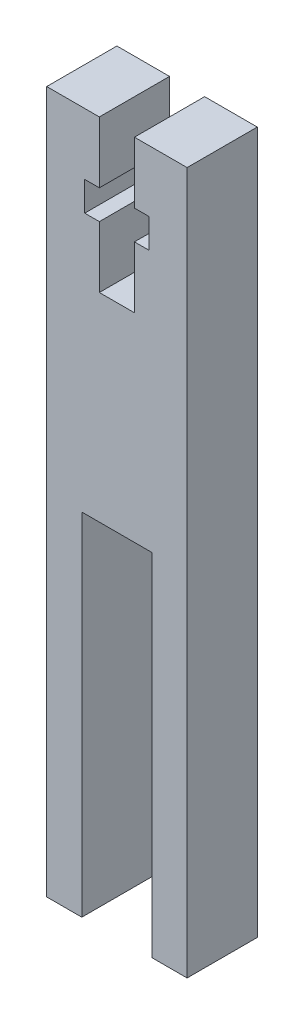
ISO-10303-21;
HEADER;
FILE_DESCRIPTION(('STEP AP214'),'2;1');
FILE_NAME('part.step','',(''),(''),'','','');
FILE_SCHEMA(('AUTOMOTIVE_DESIGN { 1 0 10303 214 1 1 1 1 }'));
ENDSEC;
DATA;
#1=APPLICATION_CONTEXT('core data for automotive mechanical design processes');
#2=APPLICATION_PROTOCOL_DEFINITION('international standard','automotive_design',2000,#1);
#3=PRODUCT_CONTEXT('',#1,'mechanical');
#4=PRODUCT('Part','Part','',(#3));
#5=PRODUCT_RELATED_PRODUCT_CATEGORY('part','',(#4));
#6=PRODUCT_DEFINITION_FORMATION('','',#4);
#7=PRODUCT_DEFINITION_CONTEXT('part definition',#1,'design');
#8=PRODUCT_DEFINITION('design','',#6,#7);
#9=PRODUCT_DEFINITION_SHAPE('','',#8);
#10=(LENGTH_UNIT() NAMED_UNIT(*) SI_UNIT(.MILLI.,.METRE.));
#11=(NAMED_UNIT(*) PLANE_ANGLE_UNIT() SI_UNIT($,.RADIAN.));
#12=(NAMED_UNIT(*) SI_UNIT($,.STERADIAN.) SOLID_ANGLE_UNIT());
#13=UNCERTAINTY_MEASURE_WITH_UNIT(LENGTH_MEASURE(1.E-05),#10,'distance_accuracy_value','');
#14=(GEOMETRIC_REPRESENTATION_CONTEXT(3) GLOBAL_UNCERTAINTY_ASSIGNED_CONTEXT((#13)) GLOBAL_UNIT_ASSIGNED_CONTEXT((#10,
#11,#12)) REPRESENTATION_CONTEXT('',''));
#15=CARTESIAN_POINT('',(0.,0.,0.));
#16=DIRECTION('',(0.,0.,1.));
#17=DIRECTION('',(1.,0.,0.));
#18=AXIS2_PLACEMENT_3D('',#15,#16,#17);
#19=CARTESIAN_POINT('',(-1.5,60.,6.));
#20=DIRECTION('',(0.,-1.,0.));
#21=DIRECTION('',(1.,0.,0.));
#22=AXIS2_PLACEMENT_3D('',#19,#20,#21);
#23=PLANE('',#22);
#24=DIRECTION('',(-1.,0.,0.));
#25=VECTOR('',#24,1.);
#26=CARTESIAN_POINT('',(-1.5,60.,0.));
#27=LINE('',#26,#25);
#28=CARTESIAN_POINT('',(-1.5,60.,0.));
#29=VERTEX_POINT('',#28);
#30=CARTESIAN_POINT('',(-5.99999999999999,60.,0.));
#31=VERTEX_POINT('',#30);
#32=EDGE_CURVE('E212',#29,#31,#27,.T.);
#33=ORIENTED_EDGE('',*,*,#32,.T.);
#34=DIRECTION('',(0.,0.,-1.));
#35=VECTOR('',#34,1.);
#36=CARTESIAN_POINT('',(-5.99999999999999,60.,6.));
#37=LINE('',#36,#35);
#38=CARTESIAN_POINT('',(-5.99999999999999,60.,6.));
#39=VERTEX_POINT('',#38);
#40=EDGE_CURVE('E11',#39,#31,#37,.T.);
#41=ORIENTED_EDGE('',*,*,#40,.F.);
#42=DIRECTION('',(-1.,0.,0.));
#43=VECTOR('',#42,1.);
#44=CARTESIAN_POINT('',(-1.5,60.,6.));
#45=LINE('',#44,#43);
#46=CARTESIAN_POINT('',(-1.5,60.,6.));
#47=VERTEX_POINT('',#46);
#48=EDGE_CURVE('E270',#47,#39,#45,.T.);
#49=ORIENTED_EDGE('',*,*,#48,.F.);
#50=DIRECTION('',(0.,0.,-1.));
#51=VECTOR('',#50,1.);
#52=CARTESIAN_POINT('',(-1.5,60.,6.));
#53=LINE('',#52,#51);
#54=EDGE_CURVE('E208',#47,#29,#53,.T.);
#55=ORIENTED_EDGE('',*,*,#54,.T.);
#56=EDGE_LOOP('',(#33,#41,#49,#55));
#57=FACE_BOUND('',#56,.T.);
#58=ADVANCED_FACE('F39',(#57),#23,.F.);
#59=CARTESIAN_POINT('',(-5.99999999999999,60.,6.));
#60=DIRECTION('',(1.,0.,0.));
#61=DIRECTION('',(0.,1.,0.));
#62=AXIS2_PLACEMENT_3D('',#59,#60,#61);
#63=PLANE('',#62);
#64=DIRECTION('',(0.,-1.,0.));
#65=VECTOR('',#64,1.);
#66=CARTESIAN_POINT('',(-5.99999999999999,60.,0.));
#67=LINE('',#66,#65);
#68=CARTESIAN_POINT('',(-5.99999999999999,0.,0.));
#69=VERTEX_POINT('',#68);
#70=EDGE_CURVE('E216',#31,#69,#67,.T.);
#71=ORIENTED_EDGE('',*,*,#70,.T.);
#72=DIRECTION('',(0.,0.,-1.));
#73=VECTOR('',#72,1.);
#74=CARTESIAN_POINT('',(-5.99999999999999,0.,6.));
#75=LINE('',#74,#73);
#76=CARTESIAN_POINT('',(-5.99999999999999,0.,6.));
#77=VERTEX_POINT('',#76);
#78=EDGE_CURVE('E48',#77,#69,#75,.T.);
#79=ORIENTED_EDGE('',*,*,#78,.F.);
#80=DIRECTION('',(0.,-1.,0.));
#81=VECTOR('',#80,1.);
#82=CARTESIAN_POINT('',(-5.99999999999999,60.,6.));
#83=LINE('',#82,#81);
#84=EDGE_CURVE('E135',#39,#77,#83,.T.);
#85=ORIENTED_EDGE('',*,*,#84,.F.);
#86=ORIENTED_EDGE('',*,*,#40,.T.);
#87=EDGE_LOOP('',(#71,#79,#85,#86));
#88=FACE_BOUND('',#87,.T.);
#89=ADVANCED_FACE('F420',(#88),#63,.F.);
#90=CARTESIAN_POINT('',(-5.99999999999999,0.,6.));
#91=DIRECTION('',(0.,1.,0.));
#92=DIRECTION('',(0.,0.,1.));
#93=AXIS2_PLACEMENT_3D('',#90,#91,#92);
#94=PLANE('',#93);
#95=DIRECTION('',(1.,0.,0.));
#96=VECTOR('',#95,1.);
#97=CARTESIAN_POINT('',(-5.99999999999999,0.,0.));
#98=LINE('',#97,#96);
#99=CARTESIAN_POINT('',(-3.,0.,0.));
#100=VERTEX_POINT('',#99);
#101=EDGE_CURVE('E219',#69,#100,#98,.T.);
#102=ORIENTED_EDGE('',*,*,#101,.T.);
#103=DIRECTION('',(0.,0.,-1.));
#104=VECTOR('',#103,1.);
#105=CARTESIAN_POINT('',(-3.,0.,6.));
#106=LINE('',#105,#104);
#107=CARTESIAN_POINT('',(-3.,0.,6.));
#108=VERTEX_POINT('',#107);
#109=EDGE_CURVE('E329',#108,#100,#106,.T.);
#110=ORIENTED_EDGE('',*,*,#109,.F.);
#111=DIRECTION('',(1.,0.,0.));
#112=VECTOR('',#111,1.);
#113=CARTESIAN_POINT('',(-5.99999999999999,0.,6.));
#114=LINE('',#113,#112);
#115=EDGE_CURVE('E339',#77,#108,#114,.T.);
#116=ORIENTED_EDGE('',*,*,#115,.F.);
#117=ORIENTED_EDGE('',*,*,#78,.T.);
#118=EDGE_LOOP('',(#102,#110,#116,#117));
#119=FACE_BOUND('',#118,.T.);
#120=ADVANCED_FACE('F337',(#119),#94,.F.);
#121=CARTESIAN_POINT('',(-3.,0.,6.));
#122=DIRECTION('',(-1.,0.,0.));
#123=DIRECTION('',(0.,0.,1.));
#124=AXIS2_PLACEMENT_3D('',#121,#122,#123);
#125=PLANE('',#124);
#126=DIRECTION('',(0.,1.,0.));
#127=VECTOR('',#126,1.);
#128=CARTESIAN_POINT('',(-3.,0.,0.));
#129=LINE('',#128,#127);
#130=CARTESIAN_POINT('',(-3.,30.,0.));
#131=VERTEX_POINT('',#130);
#132=EDGE_CURVE('E222',#100,#131,#129,.T.);
#133=ORIENTED_EDGE('',*,*,#132,.T.);
#134=DIRECTION('',(0.,0.,-1.));
#135=VECTOR('',#134,1.);
#136=CARTESIAN_POINT('',(-3.,30.,6.));
#137=LINE('',#136,#135);
#138=CARTESIAN_POINT('',(-3.,30.,6.));
#139=VERTEX_POINT('',#138);
#140=EDGE_CURVE('E325',#139,#131,#137,.T.);
#141=ORIENTED_EDGE('',*,*,#140,.F.);
#142=DIRECTION('',(0.,1.,0.));
#143=VECTOR('',#142,1.);
#144=CARTESIAN_POINT('',(-3.,0.,6.));
#145=LINE('',#144,#143);
#146=EDGE_CURVE('E358',#108,#139,#145,.T.);
#147=ORIENTED_EDGE('',*,*,#146,.F.);
#148=ORIENTED_EDGE('',*,*,#109,.T.);
#149=EDGE_LOOP('',(#133,#141,#147,#148));
#150=FACE_BOUND('',#149,.T.);
#151=ADVANCED_FACE('F348',(#150),#125,.F.);
#152=CARTESIAN_POINT('',(-3.,30.,6.));
#153=DIRECTION('',(0.,1.,0.));
#154=DIRECTION('',(0.,0.,1.));
#155=AXIS2_PLACEMENT_3D('',#152,#153,#154);
#156=PLANE('',#155);
#157=DIRECTION('',(1.,0.,0.));
#158=VECTOR('',#157,1.);
#159=CARTESIAN_POINT('',(-3.,30.,0.));
#160=LINE('',#159,#158);
#161=CARTESIAN_POINT('',(3.,30.,0.));
#162=VERTEX_POINT('',#161);
#163=EDGE_CURVE('E225',#131,#162,#160,.T.);
#164=ORIENTED_EDGE('',*,*,#163,.T.);
#165=DIRECTION('',(0.,0.,-1.));
#166=VECTOR('',#165,1.);
#167=CARTESIAN_POINT('',(3.,30.,6.));
#168=LINE('',#167,#166);
#169=CARTESIAN_POINT('',(3.,30.,6.));
#170=VERTEX_POINT('',#169);
#171=EDGE_CURVE('E321',#170,#162,#168,.T.);
#172=ORIENTED_EDGE('',*,*,#171,.F.);
#173=DIRECTION('',(1.,0.,0.));
#174=VECTOR('',#173,1.);
#175=CARTESIAN_POINT('',(-3.,30.,6.));
#176=LINE('',#175,#174);
#177=EDGE_CURVE('E354',#139,#170,#176,.T.);
#178=ORIENTED_EDGE('',*,*,#177,.F.);
#179=ORIENTED_EDGE('',*,*,#140,.T.);
#180=EDGE_LOOP('',(#164,#172,#178,#179));
#181=FACE_BOUND('',#180,.T.);
#182=ADVANCED_FACE('F352',(#181),#156,.F.);
#183=CARTESIAN_POINT('',(3.,0.,6.));
#184=DIRECTION('',(1.,0.,0.));
#185=DIRECTION('',(0.,0.,-1.));
#186=AXIS2_PLACEMENT_3D('',#183,#184,#185);
#187=PLANE('',#186);
#188=DIRECTION('',(0.,-1.,0.));
#189=VECTOR('',#188,1.);
#190=CARTESIAN_POINT('',(3.,0.,0.));
#191=LINE('',#190,#189);
#192=CARTESIAN_POINT('',(3.,0.,0.));
#193=VERTEX_POINT('',#192);
#194=EDGE_CURVE('E228',#162,#193,#191,.T.);
#195=ORIENTED_EDGE('',*,*,#194,.T.);
#196=DIRECTION('',(0.,0.,-1.));
#197=VECTOR('',#196,1.);
#198=CARTESIAN_POINT('',(3.,0.,6.));
#199=LINE('',#198,#197);
#200=CARTESIAN_POINT('',(3.,0.,6.));
#201=VERTEX_POINT('',#200);
#202=EDGE_CURVE('E317',#201,#193,#199,.T.);
#203=ORIENTED_EDGE('',*,*,#202,.F.);
#204=DIRECTION('',(0.,-1.,0.));
#205=VECTOR('',#204,1.);
#206=CARTESIAN_POINT('',(3.,0.,6.));
#207=LINE('',#206,#205);
#208=EDGE_CURVE('E357',#170,#201,#207,.T.);
#209=ORIENTED_EDGE('',*,*,#208,.F.);
#210=ORIENTED_EDGE('',*,*,#171,.T.);
#211=EDGE_LOOP('',(#195,#203,#209,#210));
#212=FACE_BOUND('',#211,.T.);
#213=ADVANCED_FACE('F433',(#212),#187,.F.);
#214=CARTESIAN_POINT('',(5.99999999999999,0.,6.));
#215=DIRECTION('',(0.,1.,0.));
#216=DIRECTION('',(0.,0.,1.));
#217=AXIS2_PLACEMENT_3D('',#214,#215,#216);
#218=PLANE('',#217);
#219=DIRECTION('',(1.,0.,0.));
#220=VECTOR('',#219,1.);
#221=CARTESIAN_POINT('',(5.99999999999999,0.,0.));
#222=LINE('',#221,#220);
#223=CARTESIAN_POINT('',(5.99999999999999,0.,0.));
#224=VERTEX_POINT('',#223);
#225=EDGE_CURVE('E231',#193,#224,#222,.T.);
#226=ORIENTED_EDGE('',*,*,#225,.T.);
#227=DIRECTION('',(0.,0.,-1.));
#228=VECTOR('',#227,1.);
#229=CARTESIAN_POINT('',(5.99999999999999,0.,6.));
#230=LINE('',#229,#228);
#231=CARTESIAN_POINT('',(5.99999999999999,0.,6.));
#232=VERTEX_POINT('',#231);
#233=EDGE_CURVE('E313',#232,#224,#230,.T.);
#234=ORIENTED_EDGE('',*,*,#233,.F.);
#235=DIRECTION('',(1.,0.,0.));
#236=VECTOR('',#235,1.);
#237=CARTESIAN_POINT('',(5.99999999999999,0.,6.));
#238=LINE('',#237,#236);
#239=EDGE_CURVE('E362',#201,#232,#238,.T.);
#240=ORIENTED_EDGE('',*,*,#239,.F.);
#241=ORIENTED_EDGE('',*,*,#202,.T.);
#242=EDGE_LOOP('',(#226,#234,#240,#241));
#243=FACE_BOUND('',#242,.T.);
#244=ADVANCED_FACE('F436',(#243),#218,.F.);
#245=CARTESIAN_POINT('',(5.99999999999999,60.,6.));
#246=DIRECTION('',(-1.,0.,0.));
#247=DIRECTION('',(0.,-1.,0.));
#248=AXIS2_PLACEMENT_3D('',#245,#246,#247);
#249=PLANE('',#248);
#250=DIRECTION('',(0.,1.,0.));
#251=VECTOR('',#250,1.);
#252=CARTESIAN_POINT('',(5.99999999999999,60.,0.));
#253=LINE('',#252,#251);
#254=CARTESIAN_POINT('',(5.99999999999999,60.,0.));
#255=VERTEX_POINT('',#254);
#256=EDGE_CURVE('E234',#224,#255,#253,.T.);
#257=ORIENTED_EDGE('',*,*,#256,.T.);
#258=DIRECTION('',(0.,0.,-1.));
#259=VECTOR('',#258,1.);
#260=CARTESIAN_POINT('',(5.99999999999999,60.,6.));
#261=LINE('',#260,#259);
#262=CARTESIAN_POINT('',(5.99999999999999,60.,6.));
#263=VERTEX_POINT('',#262);
#264=EDGE_CURVE('E309',#263,#255,#261,.T.);
#265=ORIENTED_EDGE('',*,*,#264,.F.);
#266=DIRECTION('',(0.,1.,0.));
#267=VECTOR('',#266,1.);
#268=CARTESIAN_POINT('',(5.99999999999999,60.,6.));
#269=LINE('',#268,#267);
#270=EDGE_CURVE('E369',#232,#263,#269,.T.);
#271=ORIENTED_EDGE('',*,*,#270,.F.);
#272=ORIENTED_EDGE('',*,*,#233,.T.);
#273=EDGE_LOOP('',(#257,#265,#271,#272));
#274=FACE_BOUND('',#273,.T.);
#275=ADVANCED_FACE('F440',(#274),#249,.F.);
#276=CARTESIAN_POINT('',(1.5,60.,6.));
#277=DIRECTION('',(0.,-1.,0.));
#278=DIRECTION('',(1.,0.,0.));
#279=AXIS2_PLACEMENT_3D('',#276,#277,#278);
#280=PLANE('',#279);
#281=DIRECTION('',(-1.,0.,0.));
#282=VECTOR('',#281,1.);
#283=CARTESIAN_POINT('',(1.5,60.,0.));
#284=LINE('',#283,#282);
#285=CARTESIAN_POINT('',(1.5,60.,0.));
#286=VERTEX_POINT('',#285);
#287=EDGE_CURVE('E237',#255,#286,#284,.T.);
#288=ORIENTED_EDGE('',*,*,#287,.T.);
#289=DIRECTION('',(0.,0.,-1.));
#290=VECTOR('',#289,1.);
#291=CARTESIAN_POINT('',(1.5,60.,6.));
#292=LINE('',#291,#290);
#293=CARTESIAN_POINT('',(1.5,60.,6.));
#294=VERTEX_POINT('',#293);
#295=EDGE_CURVE('E305',#294,#286,#292,.T.);
#296=ORIENTED_EDGE('',*,*,#295,.F.);
#297=DIRECTION('',(-1.,0.,0.));
#298=VECTOR('',#297,1.);
#299=CARTESIAN_POINT('',(1.5,60.,6.));
#300=LINE('',#299,#298);
#301=EDGE_CURVE('E372',#263,#294,#300,.T.);
#302=ORIENTED_EDGE('',*,*,#301,.F.);
#303=ORIENTED_EDGE('',*,*,#264,.T.);
#304=EDGE_LOOP('',(#288,#296,#302,#303));
#305=FACE_BOUND('',#304,.T.);
#306=ADVANCED_FACE('F444',(#305),#280,.F.);
#307=CARTESIAN_POINT('',(1.5,60.,6.));
#308=DIRECTION('',(1.,0.,0.));
#309=DIRECTION('',(0.,1.,0.));
#310=AXIS2_PLACEMENT_3D('',#307,#308,#309);
#311=PLANE('',#310);
#312=DIRECTION('',(0.,-1.,0.));
#313=VECTOR('',#312,1.);
#314=CARTESIAN_POINT('',(1.5,60.,0.));
#315=LINE('',#314,#313);
#316=CARTESIAN_POINT('',(1.5,54.75,0.));
#317=VERTEX_POINT('',#316);
#318=EDGE_CURVE('E240',#286,#317,#315,.T.);
#319=ORIENTED_EDGE('',*,*,#318,.T.);
#320=DIRECTION('',(0.,0.,-1.));
#321=VECTOR('',#320,1.);
#322=CARTESIAN_POINT('',(1.5,54.75,6.));
#323=LINE('',#322,#321);
#324=CARTESIAN_POINT('',(1.5,54.75,6.));
#325=VERTEX_POINT('',#324);
#326=EDGE_CURVE('E301',#325,#317,#323,.T.);
#327=ORIENTED_EDGE('',*,*,#326,.F.);
#328=DIRECTION('',(0.,-1.,0.));
#329=VECTOR('',#328,1.);
#330=CARTESIAN_POINT('',(1.5,60.,6.));
#331=LINE('',#330,#329);
#332=EDGE_CURVE('E375',#294,#325,#331,.T.);
#333=ORIENTED_EDGE('',*,*,#332,.F.);
#334=ORIENTED_EDGE('',*,*,#295,.T.);
#335=EDGE_LOOP('',(#319,#327,#333,#334));
#336=FACE_BOUND('',#335,.T.);
#337=ADVANCED_FACE('F448',(#336),#311,.F.);
#338=CARTESIAN_POINT('',(1.5,54.75,6.));
#339=DIRECTION('',(0.,1.,0.));
#340=DIRECTION('',(0.,0.,1.));
#341=AXIS2_PLACEMENT_3D('',#338,#339,#340);
#342=PLANE('',#341);
#343=DIRECTION('',(1.,0.,0.));
#344=VECTOR('',#343,1.);
#345=CARTESIAN_POINT('',(1.5,54.75,0.));
#346=LINE('',#345,#344);
#347=CARTESIAN_POINT('',(2.75,54.75,0.));
#348=VERTEX_POINT('',#347);
#349=EDGE_CURVE('E243',#317,#348,#346,.T.);
#350=ORIENTED_EDGE('',*,*,#349,.T.);
#351=DIRECTION('',(0.,0.,-1.));
#352=VECTOR('',#351,1.);
#353=CARTESIAN_POINT('',(2.75,54.75,6.));
#354=LINE('',#353,#352);
#355=CARTESIAN_POINT('',(2.75,54.75,6.));
#356=VERTEX_POINT('',#355);
#357=EDGE_CURVE('E297',#356,#348,#354,.T.);
#358=ORIENTED_EDGE('',*,*,#357,.F.);
#359=DIRECTION('',(1.,0.,0.));
#360=VECTOR('',#359,1.);
#361=CARTESIAN_POINT('',(1.5,54.75,6.));
#362=LINE('',#361,#360);
#363=EDGE_CURVE('E378',#325,#356,#362,.T.);
#364=ORIENTED_EDGE('',*,*,#363,.F.);
#365=ORIENTED_EDGE('',*,*,#326,.T.);
#366=EDGE_LOOP('',(#350,#358,#364,#365));
#367=FACE_BOUND('',#366,.T.);
#368=ADVANCED_FACE('F452',(#367),#342,.F.);
#369=CARTESIAN_POINT('',(2.75,54.75,6.));
#370=DIRECTION('',(1.,0.,0.));
#371=DIRECTION('',(0.,0.,-1.));
#372=AXIS2_PLACEMENT_3D('',#369,#370,#371);
#373=PLANE('',#372);
#374=DIRECTION('',(0.,-1.,0.));
#375=VECTOR('',#374,1.);
#376=CARTESIAN_POINT('',(2.75,54.75,0.));
#377=LINE('',#376,#375);
#378=CARTESIAN_POINT('',(2.75,52.25,0.));
#379=VERTEX_POINT('',#378);
#380=EDGE_CURVE('E246',#348,#379,#377,.T.);
#381=ORIENTED_EDGE('',*,*,#380,.T.);
#382=DIRECTION('',(0.,0.,-1.));
#383=VECTOR('',#382,1.);
#384=CARTESIAN_POINT('',(2.75,52.25,6.));
#385=LINE('',#384,#383);
#386=CARTESIAN_POINT('',(2.75,52.25,6.));
#387=VERTEX_POINT('',#386);
#388=EDGE_CURVE('E293',#387,#379,#385,.T.);
#389=ORIENTED_EDGE('',*,*,#388,.F.);
#390=DIRECTION('',(0.,-1.,0.));
#391=VECTOR('',#390,1.);
#392=CARTESIAN_POINT('',(2.75,54.75,6.));
#393=LINE('',#392,#391);
#394=EDGE_CURVE('E381',#356,#387,#393,.T.);
#395=ORIENTED_EDGE('',*,*,#394,.F.);
#396=ORIENTED_EDGE('',*,*,#357,.T.);
#397=EDGE_LOOP('',(#381,#389,#395,#396));
#398=FACE_BOUND('',#397,.T.);
#399=ADVANCED_FACE('F456',(#398),#373,.F.);
#400=CARTESIAN_POINT('',(2.75,52.25,6.));
#401=DIRECTION('',(0.,-1.,0.));
#402=DIRECTION('',(0.,0.,-1.));
#403=AXIS2_PLACEMENT_3D('',#400,#401,#402);
#404=PLANE('',#403);
#405=DIRECTION('',(-1.,0.,0.));
#406=VECTOR('',#405,1.);
#407=CARTESIAN_POINT('',(2.75,52.25,0.));
#408=LINE('',#407,#406);
#409=CARTESIAN_POINT('',(1.5,52.25,0.));
#410=VERTEX_POINT('',#409);
#411=EDGE_CURVE('E249',#379,#410,#408,.T.);
#412=ORIENTED_EDGE('',*,*,#411,.T.);
#413=DIRECTION('',(0.,0.,-1.));
#414=VECTOR('',#413,1.);
#415=CARTESIAN_POINT('',(1.5,52.25,6.));
#416=LINE('',#415,#414);
#417=CARTESIAN_POINT('',(1.5,52.25,6.));
#418=VERTEX_POINT('',#417);
#419=EDGE_CURVE('E289',#418,#410,#416,.T.);
#420=ORIENTED_EDGE('',*,*,#419,.F.);
#421=DIRECTION('',(-1.,0.,0.));
#422=VECTOR('',#421,1.);
#423=CARTESIAN_POINT('',(2.75,52.25,6.));
#424=LINE('',#423,#422);
#425=EDGE_CURVE('E384',#387,#418,#424,.T.);
#426=ORIENTED_EDGE('',*,*,#425,.F.);
#427=ORIENTED_EDGE('',*,*,#388,.T.);
#428=EDGE_LOOP('',(#412,#420,#426,#427));
#429=FACE_BOUND('',#428,.T.);
#430=ADVANCED_FACE('F460',(#429),#404,.F.);
#431=CARTESIAN_POINT('',(1.5,52.25,6.));
#432=DIRECTION('',(1.,0.,0.));
#433=DIRECTION('',(0.,1.,0.));
#434=AXIS2_PLACEMENT_3D('',#431,#432,#433);
#435=PLANE('',#434);
#436=DIRECTION('',(0.,-1.,0.));
#437=VECTOR('',#436,1.);
#438=CARTESIAN_POINT('',(1.5,52.25,0.));
#439=LINE('',#438,#437);
#440=CARTESIAN_POINT('',(1.5,47.0000000000001,0.));
#441=VERTEX_POINT('',#440);
#442=EDGE_CURVE('E252',#410,#441,#439,.T.);
#443=ORIENTED_EDGE('',*,*,#442,.T.);
#444=DIRECTION('',(0.,0.,-1.));
#445=VECTOR('',#444,1.);
#446=CARTESIAN_POINT('',(1.5,47.0000000000001,6.));
#447=LINE('',#446,#445);
#448=CARTESIAN_POINT('',(1.5,47.0000000000001,6.));
#449=VERTEX_POINT('',#448);
#450=EDGE_CURVE('E285',#449,#441,#447,.T.);
#451=ORIENTED_EDGE('',*,*,#450,.F.);
#452=DIRECTION('',(0.,-1.,0.));
#453=VECTOR('',#452,1.);
#454=CARTESIAN_POINT('',(1.5,52.25,6.));
#455=LINE('',#454,#453);
#456=EDGE_CURVE('E387',#418,#449,#455,.T.);
#457=ORIENTED_EDGE('',*,*,#456,.F.);
#458=ORIENTED_EDGE('',*,*,#419,.T.);
#459=EDGE_LOOP('',(#443,#451,#457,#458));
#460=FACE_BOUND('',#459,.T.);
#461=ADVANCED_FACE('F464',(#460),#435,.F.);
#462=CARTESIAN_POINT('',(-1.5,47.,6.));
#463=DIRECTION('',(0.,-1.,0.));
#464=DIRECTION('',(1.,0.,0.));
#465=AXIS2_PLACEMENT_3D('',#462,#463,#464);
#466=PLANE('',#465);
#467=DIRECTION('',(-1.,0.,0.));
#468=VECTOR('',#467,1.);
#469=CARTESIAN_POINT('',(-1.5,47.,0.));
#470=LINE('',#469,#468);
#471=CARTESIAN_POINT('',(-1.5,47.,0.));
#472=VERTEX_POINT('',#471);
#473=EDGE_CURVE('E255',#441,#472,#470,.T.);
#474=ORIENTED_EDGE('',*,*,#473,.T.);
#475=DIRECTION('',(0.,0.,-1.));
#476=VECTOR('',#475,1.);
#477=CARTESIAN_POINT('',(-1.5,47.,6.));
#478=LINE('',#477,#476);
#479=CARTESIAN_POINT('',(-1.5,47.,6.));
#480=VERTEX_POINT('',#479);
#481=EDGE_CURVE('E281',#480,#472,#478,.T.);
#482=ORIENTED_EDGE('',*,*,#481,.F.);
#483=DIRECTION('',(-1.,0.,0.));
#484=VECTOR('',#483,1.);
#485=CARTESIAN_POINT('',(-1.5,47.,6.));
#486=LINE('',#485,#484);
#487=EDGE_CURVE('E390',#449,#480,#486,.T.);
#488=ORIENTED_EDGE('',*,*,#487,.F.);
#489=ORIENTED_EDGE('',*,*,#450,.T.);
#490=EDGE_LOOP('',(#474,#482,#488,#489));
#491=FACE_BOUND('',#490,.T.);
#492=ADVANCED_FACE('F468',(#491),#466,.F.);
#493=CARTESIAN_POINT('',(-1.5,52.25,6.));
#494=DIRECTION('',(-1.,0.,0.));
#495=DIRECTION('',(0.,-1.,0.));
#496=AXIS2_PLACEMENT_3D('',#493,#494,#495);
#497=PLANE('',#496);
#498=DIRECTION('',(0.,1.,0.));
#499=VECTOR('',#498,1.);
#500=CARTESIAN_POINT('',(-1.5,52.25,0.));
#501=LINE('',#500,#499);
#502=CARTESIAN_POINT('',(-1.5,52.25,0.));
#503=VERTEX_POINT('',#502);
#504=EDGE_CURVE('E258',#472,#503,#501,.T.);
#505=ORIENTED_EDGE('',*,*,#504,.T.);
#506=DIRECTION('',(0.,0.,-1.));
#507=VECTOR('',#506,1.);
#508=CARTESIAN_POINT('',(-1.5,52.25,6.));
#509=LINE('',#508,#507);
#510=CARTESIAN_POINT('',(-1.5,52.25,6.));
#511=VERTEX_POINT('',#510);
#512=EDGE_CURVE('E277',#511,#503,#509,.T.);
#513=ORIENTED_EDGE('',*,*,#512,.F.);
#514=DIRECTION('',(0.,1.,0.));
#515=VECTOR('',#514,1.);
#516=CARTESIAN_POINT('',(-1.5,52.25,6.));
#517=LINE('',#516,#515);
#518=EDGE_CURVE('E393',#480,#511,#517,.T.);
#519=ORIENTED_EDGE('',*,*,#518,.F.);
#520=ORIENTED_EDGE('',*,*,#481,.T.);
#521=EDGE_LOOP('',(#505,#513,#519,#520));
#522=FACE_BOUND('',#521,.T.);
#523=ADVANCED_FACE('F401',(#522),#497,.F.);
#524=CARTESIAN_POINT('',(-2.75,52.25,6.));
#525=DIRECTION('',(0.,-1.,0.));
#526=DIRECTION('',(0.,0.,-1.));
#527=AXIS2_PLACEMENT_3D('',#524,#525,#526);
#528=PLANE('',#527);
#529=DIRECTION('',(-1.,0.,0.));
#530=VECTOR('',#529,1.);
#531=CARTESIAN_POINT('',(-2.75,52.25,0.));
#532=LINE('',#531,#530);
#533=CARTESIAN_POINT('',(-2.75,52.25,0.));
#534=VERTEX_POINT('',#533);
#535=EDGE_CURVE('E261',#503,#534,#532,.T.);
#536=ORIENTED_EDGE('',*,*,#535,.T.);
#537=DIRECTION('',(0.,0.,-1.));
#538=VECTOR('',#537,1.);
#539=CARTESIAN_POINT('',(-2.75,52.25,6.));
#540=LINE('',#539,#538);
#541=CARTESIAN_POINT('',(-2.75,52.25,6.));
#542=VERTEX_POINT('',#541);
#543=EDGE_CURVE('E201',#542,#534,#540,.T.);
#544=ORIENTED_EDGE('',*,*,#543,.F.);
#545=DIRECTION('',(-1.,0.,0.));
#546=VECTOR('',#545,1.);
#547=CARTESIAN_POINT('',(-2.75,52.25,6.));
#548=LINE('',#547,#546);
#549=EDGE_CURVE('E190',#511,#542,#548,.T.);
#550=ORIENTED_EDGE('',*,*,#549,.F.);
#551=ORIENTED_EDGE('',*,*,#512,.T.);
#552=EDGE_LOOP('',(#536,#544,#550,#551));
#553=FACE_BOUND('',#552,.T.);
#554=ADVANCED_FACE('F405',(#553),#528,.F.);
#555=CARTESIAN_POINT('',(-2.75,54.75,6.));
#556=DIRECTION('',(-1.,0.,0.));
#557=DIRECTION('',(0.,0.,1.));
#558=AXIS2_PLACEMENT_3D('',#555,#556,#557);
#559=PLANE('',#558);
#560=DIRECTION('',(0.,1.,0.));
#561=VECTOR('',#560,1.);
#562=CARTESIAN_POINT('',(-2.75,54.75,0.));
#563=LINE('',#562,#561);
#564=CARTESIAN_POINT('',(-2.75,54.75,0.));
#565=VERTEX_POINT('',#564);
#566=EDGE_CURVE('E199',#534,#565,#563,.T.);
#567=ORIENTED_EDGE('',*,*,#566,.T.);
#568=DIRECTION('',(0.,0.,-1.));
#569=VECTOR('',#568,1.);
#570=CARTESIAN_POINT('',(-2.75,54.75,6.));
#571=LINE('',#570,#569);
#572=CARTESIAN_POINT('',(-2.75,54.75,6.));
#573=VERTEX_POINT('',#572);
#574=EDGE_CURVE('E196',#573,#565,#571,.T.);
#575=ORIENTED_EDGE('',*,*,#574,.F.);
#576=DIRECTION('',(0.,1.,0.));
#577=VECTOR('',#576,1.);
#578=CARTESIAN_POINT('',(-2.75,54.75,6.));
#579=LINE('',#578,#577);
#580=EDGE_CURVE('E184',#542,#573,#579,.T.);
#581=ORIENTED_EDGE('',*,*,#580,.F.);
#582=ORIENTED_EDGE('',*,*,#543,.T.);
#583=EDGE_LOOP('',(#567,#575,#581,#582));
#584=FACE_BOUND('',#583,.T.);
#585=ADVANCED_FACE('F197',(#584),#559,.F.);
#586=CARTESIAN_POINT('',(-1.5,54.75,6.));
#587=DIRECTION('',(0.,1.,0.));
#588=DIRECTION('',(0.,0.,1.));
#589=AXIS2_PLACEMENT_3D('',#586,#587,#588);
#590=PLANE('',#589);
#591=DIRECTION('',(1.,0.,0.));
#592=VECTOR('',#591,1.);
#593=CARTESIAN_POINT('',(-1.5,54.75,0.));
#594=LINE('',#593,#592);
#595=CARTESIAN_POINT('',(-1.5,54.75,0.));
#596=VERTEX_POINT('',#595);
#597=EDGE_CURVE('E121',#565,#596,#594,.T.);
#598=ORIENTED_EDGE('',*,*,#597,.T.);
#599=DIRECTION('',(0.,0.,-1.));
#600=VECTOR('',#599,1.);
#601=CARTESIAN_POINT('',(-1.5,54.75,6.));
#602=LINE('',#601,#600);
#603=CARTESIAN_POINT('',(-1.5,54.75,6.));
#604=VERTEX_POINT('',#603);
#605=EDGE_CURVE('E202',#604,#596,#602,.T.);
#606=ORIENTED_EDGE('',*,*,#605,.F.);
#607=DIRECTION('',(1.,0.,0.));
#608=VECTOR('',#607,1.);
#609=CARTESIAN_POINT('',(-1.5,54.75,6.));
#610=LINE('',#609,#608);
#611=EDGE_CURVE('E188',#573,#604,#610,.T.);
#612=ORIENTED_EDGE('',*,*,#611,.F.);
#613=ORIENTED_EDGE('',*,*,#574,.T.);
#614=EDGE_LOOP('',(#598,#606,#612,#613));
#615=FACE_BOUND('',#614,.T.);
#616=ADVANCED_FACE('F204',(#615),#590,.F.);
#617=CARTESIAN_POINT('',(-1.5,60.,6.));
#618=DIRECTION('',(-1.,0.,0.));
#619=DIRECTION('',(0.,-1.,0.));
#620=AXIS2_PLACEMENT_3D('',#617,#618,#619);
#621=PLANE('',#620);
#622=DIRECTION('',(0.,1.,0.));
#623=VECTOR('',#622,1.);
#624=CARTESIAN_POINT('',(-1.5,60.,0.));
#625=LINE('',#624,#623);
#626=EDGE_CURVE('E127',#596,#29,#625,.T.);
#627=ORIENTED_EDGE('',*,*,#626,.T.);
#628=ORIENTED_EDGE('',*,*,#54,.F.);
#629=DIRECTION('',(0.,1.,0.));
#630=VECTOR('',#629,1.);
#631=CARTESIAN_POINT('',(-1.5,60.,6.));
#632=LINE('',#631,#630);
#633=EDGE_CURVE('E56',#604,#47,#632,.T.);
#634=ORIENTED_EDGE('',*,*,#633,.F.);
#635=ORIENTED_EDGE('',*,*,#605,.T.);
#636=EDGE_LOOP('',(#627,#628,#634,#635));
#637=FACE_BOUND('',#636,.T.);
#638=ADVANCED_FACE('F409',(#637),#621,.F.);
#639=CARTESIAN_POINT('',(0.,0.,6.));
#640=DIRECTION('',(0.,0.,1.));
#641=DIRECTION('',(1.,0.,0.));
#642=AXIS2_PLACEMENT_3D('',#639,#640,#641);
#643=PLANE('',#642);
#644=ORIENTED_EDGE('',*,*,#48,.T.);
#645=ORIENTED_EDGE('',*,*,#84,.T.);
#646=ORIENTED_EDGE('',*,*,#115,.T.);
#647=ORIENTED_EDGE('',*,*,#146,.T.);
#648=ORIENTED_EDGE('',*,*,#177,.T.);
#649=ORIENTED_EDGE('',*,*,#208,.T.);
#650=ORIENTED_EDGE('',*,*,#239,.T.);
#651=ORIENTED_EDGE('',*,*,#270,.T.);
#652=ORIENTED_EDGE('',*,*,#301,.T.);
#653=ORIENTED_EDGE('',*,*,#332,.T.);
#654=ORIENTED_EDGE('',*,*,#363,.T.);
#655=ORIENTED_EDGE('',*,*,#394,.T.);
#656=ORIENTED_EDGE('',*,*,#425,.T.);
#657=ORIENTED_EDGE('',*,*,#456,.T.);
#658=ORIENTED_EDGE('',*,*,#487,.T.);
#659=ORIENTED_EDGE('',*,*,#518,.T.);
#660=ORIENTED_EDGE('',*,*,#549,.T.);
#661=ORIENTED_EDGE('',*,*,#580,.T.);
#662=ORIENTED_EDGE('',*,*,#611,.T.);
#663=ORIENTED_EDGE('',*,*,#633,.T.);
#664=EDGE_LOOP('',(#644,#645,#646,#647,#648,#649,#650,#651,#652,#653,#654,#655,#656,#657,#658,
#659,#660,#661,#662,#663));
#665=FACE_BOUND('',#664,.T.);
#666=ADVANCED_FACE('F186',(#665),#643,.T.);
#667=CARTESIAN_POINT('',(0.,0.,0.));
#668=DIRECTION('',(0.,0.,1.));
#669=DIRECTION('',(1.,0.,0.));
#670=AXIS2_PLACEMENT_3D('',#667,#668,#669);
#671=PLANE('',#670);
#672=ORIENTED_EDGE('',*,*,#32,.F.);
#673=ORIENTED_EDGE('',*,*,#626,.F.);
#674=ORIENTED_EDGE('',*,*,#597,.F.);
#675=ORIENTED_EDGE('',*,*,#566,.F.);
#676=ORIENTED_EDGE('',*,*,#535,.F.);
#677=ORIENTED_EDGE('',*,*,#504,.F.);
#678=ORIENTED_EDGE('',*,*,#473,.F.);
#679=ORIENTED_EDGE('',*,*,#442,.F.);
#680=ORIENTED_EDGE('',*,*,#411,.F.);
#681=ORIENTED_EDGE('',*,*,#380,.F.);
#682=ORIENTED_EDGE('',*,*,#349,.F.);
#683=ORIENTED_EDGE('',*,*,#318,.F.);
#684=ORIENTED_EDGE('',*,*,#287,.F.);
#685=ORIENTED_EDGE('',*,*,#256,.F.);
#686=ORIENTED_EDGE('',*,*,#225,.F.);
#687=ORIENTED_EDGE('',*,*,#194,.F.);
#688=ORIENTED_EDGE('',*,*,#163,.F.);
#689=ORIENTED_EDGE('',*,*,#132,.F.);
#690=ORIENTED_EDGE('',*,*,#101,.F.);
#691=ORIENTED_EDGE('',*,*,#70,.F.);
#692=EDGE_LOOP('',(#672,#673,#674,#675,#676,#677,#678,#679,#680,#681,#682,#683,#684,#685,#686,
#687,#688,#689,#690,#691));
#693=FACE_BOUND('',#692,.T.);
#694=ADVANCED_FACE('F343',(#693),#671,.F.);
#695=CLOSED_SHELL('',(#58,#89,#120,#151,#182,#213,#244,#275,#306,#337,#368,#399,#430,#461,#492,
#523,#554,#585,#616,#638,#666,#694));
#696=MANIFOLD_SOLID_BREP('B2',#695);
#697=ADVANCED_BREP_SHAPE_REPRESENTATION('',(#18,#696),#14);
#698=SHAPE_DEFINITION_REPRESENTATION(#9,#697);
ENDSEC;
END-ISO-10303-21;
